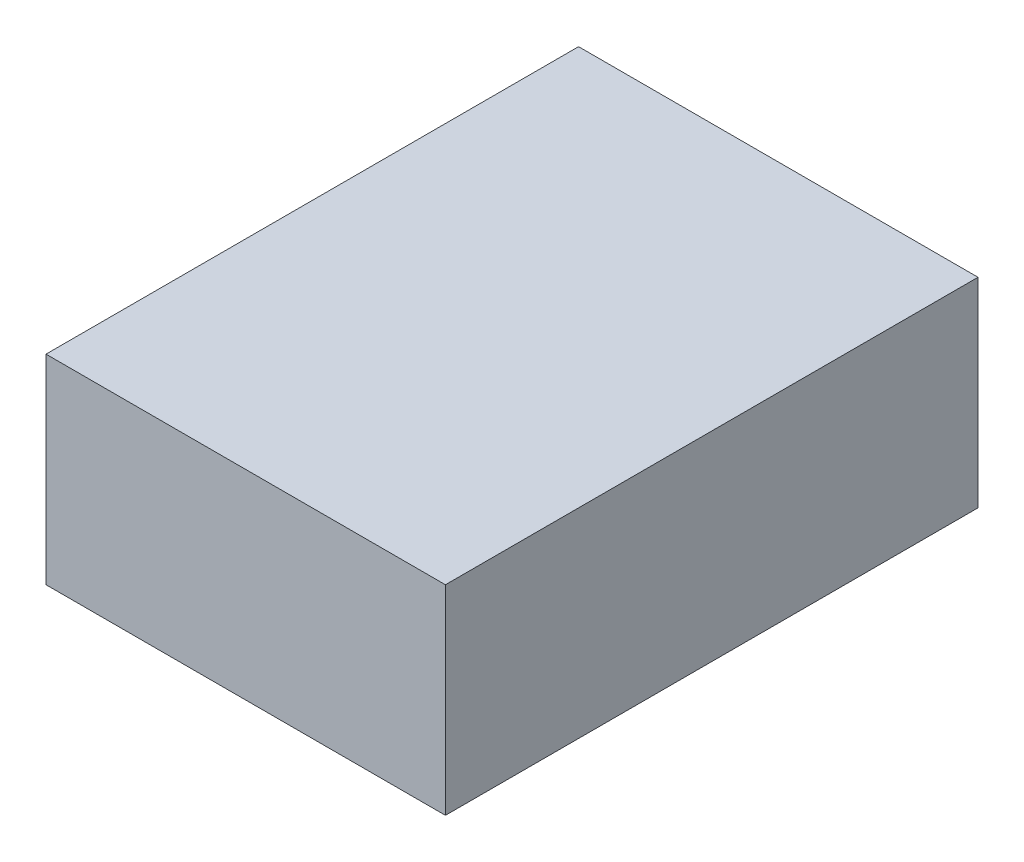
ISO-10303-21;
HEADER;
FILE_DESCRIPTION(('STEP AP214'),'2;1');
FILE_NAME('part.step','',(''),(''),'','','');
FILE_SCHEMA(('AUTOMOTIVE_DESIGN { 1 0 10303 214 1 1 1 1 }'));
ENDSEC;
DATA;
#1=APPLICATION_CONTEXT('core data for automotive mechanical design processes');
#2=APPLICATION_PROTOCOL_DEFINITION('international standard','automotive_design',2000,#1);
#3=PRODUCT_CONTEXT('',#1,'mechanical');
#4=PRODUCT('Part','Part','',(#3));
#5=PRODUCT_RELATED_PRODUCT_CATEGORY('part','',(#4));
#6=PRODUCT_DEFINITION_FORMATION('','',#4);
#7=PRODUCT_DEFINITION_CONTEXT('part definition',#1,'design');
#8=PRODUCT_DEFINITION('design','',#6,#7);
#9=PRODUCT_DEFINITION_SHAPE('','',#8);
#10=(LENGTH_UNIT() NAMED_UNIT(*) SI_UNIT(.MILLI.,.METRE.));
#11=(NAMED_UNIT(*) PLANE_ANGLE_UNIT() SI_UNIT($,.RADIAN.));
#12=(NAMED_UNIT(*) SI_UNIT($,.STERADIAN.) SOLID_ANGLE_UNIT());
#13=UNCERTAINTY_MEASURE_WITH_UNIT(LENGTH_MEASURE(1.E-05),#10,'distance_accuracy_value','');
#14=(GEOMETRIC_REPRESENTATION_CONTEXT(3) GLOBAL_UNCERTAINTY_ASSIGNED_CONTEXT((#13)) GLOBAL_UNIT_ASSIGNED_CONTEXT((#10,
#11,#12)) REPRESENTATION_CONTEXT('',''));
#15=CARTESIAN_POINT('',(0.,0.,0.));
#16=DIRECTION('',(0.,0.,1.));
#17=DIRECTION('',(1.,0.,0.));
#18=AXIS2_PLACEMENT_3D('',#15,#16,#17);
#19=CARTESIAN_POINT('',(0.,0.,40.));
#20=DIRECTION('',(-1.,0.,0.));
#21=DIRECTION('',(0.,-1.,0.));
#22=AXIS2_PLACEMENT_3D('',#19,#20,#21);
#23=PLANE('',#22);
#24=DIRECTION('',(0.,1.,0.));
#25=VECTOR('',#24,1.);
#26=CARTESIAN_POINT('',(0.,0.,0.));
#27=LINE('',#26,#25);
#28=CARTESIAN_POINT('',(0.,0.,0.));
#29=VERTEX_POINT('',#28);
#30=CARTESIAN_POINT('',(0.,15.,0.));
#31=VERTEX_POINT('',#30);
#32=EDGE_CURVE('E100',#29,#31,#27,.T.);
#33=ORIENTED_EDGE('',*,*,#32,.T.);
#34=DIRECTION('',(0.,0.,-1.));
#35=VECTOR('',#34,1.);
#36=CARTESIAN_POINT('',(0.,15.,40.));
#37=LINE('',#36,#35);
#38=CARTESIAN_POINT('',(0.,15.,40.));
#39=VERTEX_POINT('',#38);
#40=EDGE_CURVE('E11',#39,#31,#37,.T.);
#41=ORIENTED_EDGE('',*,*,#40,.F.);
#42=DIRECTION('',(0.,1.,0.));
#43=VECTOR('',#42,1.);
#44=CARTESIAN_POINT('',(0.,0.,40.));
#45=LINE('',#44,#43);
#46=CARTESIAN_POINT('',(0.,0.,40.));
#47=VERTEX_POINT('',#46);
#48=EDGE_CURVE('E88',#47,#39,#45,.T.);
#49=ORIENTED_EDGE('',*,*,#48,.F.);
#50=DIRECTION('',(0.,0.,-1.));
#51=VECTOR('',#50,1.);
#52=CARTESIAN_POINT('',(0.,0.,40.));
#53=LINE('',#52,#51);
#54=EDGE_CURVE('E96',#47,#29,#53,.T.);
#55=ORIENTED_EDGE('',*,*,#54,.T.);
#56=EDGE_LOOP('',(#33,#41,#49,#55));
#57=FACE_BOUND('',#56,.T.);
#58=ADVANCED_FACE('F37',(#57),#23,.F.);
#59=CARTESIAN_POINT('',(0.,15.,40.));
#60=DIRECTION('',(0.,-1.,0.));
#61=DIRECTION('',(1.,0.,0.));
#62=AXIS2_PLACEMENT_3D('',#59,#60,#61);
#63=PLANE('',#62);
#64=DIRECTION('',(-1.,0.,0.));
#65=VECTOR('',#64,1.);
#66=CARTESIAN_POINT('',(0.,15.,0.));
#67=LINE('',#66,#65);
#68=CARTESIAN_POINT('',(-30.,15.,0.));
#69=VERTEX_POINT('',#68);
#70=EDGE_CURVE('E92',#31,#69,#67,.T.);
#71=ORIENTED_EDGE('',*,*,#70,.T.);
#72=DIRECTION('',(0.,0.,-1.));
#73=VECTOR('',#72,1.);
#74=CARTESIAN_POINT('',(-30.,15.,40.));
#75=LINE('',#74,#73);
#76=CARTESIAN_POINT('',(-30.,15.,40.));
#77=VERTEX_POINT('',#76);
#78=EDGE_CURVE('E45',#77,#69,#75,.T.);
#79=ORIENTED_EDGE('',*,*,#78,.F.);
#80=DIRECTION('',(-1.,0.,0.));
#81=VECTOR('',#80,1.);
#82=CARTESIAN_POINT('',(0.,15.,40.));
#83=LINE('',#82,#81);
#84=EDGE_CURVE('E83',#39,#77,#83,.T.);
#85=ORIENTED_EDGE('',*,*,#84,.F.);
#86=ORIENTED_EDGE('',*,*,#40,.T.);
#87=EDGE_LOOP('',(#71,#79,#85,#86));
#88=FACE_BOUND('',#87,.T.);
#89=ADVANCED_FACE('F91',(#88),#63,.F.);
#90=CARTESIAN_POINT('',(-30.,0.,40.));
#91=DIRECTION('',(1.,0.,0.));
#92=DIRECTION('',(0.,0.,-1.));
#93=AXIS2_PLACEMENT_3D('',#90,#91,#92);
#94=PLANE('',#93);
#95=DIRECTION('',(0.,-1.,0.));
#96=VECTOR('',#95,1.);
#97=CARTESIAN_POINT('',(-30.,0.,0.));
#98=LINE('',#97,#96);
#99=CARTESIAN_POINT('',(-30.,0.,0.));
#100=VERTEX_POINT('',#99);
#101=EDGE_CURVE('E70',#69,#100,#98,.T.);
#102=ORIENTED_EDGE('',*,*,#101,.T.);
#103=DIRECTION('',(0.,0.,-1.));
#104=VECTOR('',#103,1.);
#105=CARTESIAN_POINT('',(-30.,0.,40.));
#106=LINE('',#105,#104);
#107=CARTESIAN_POINT('',(-30.,0.,40.));
#108=VERTEX_POINT('',#107);
#109=EDGE_CURVE('E93',#108,#100,#106,.T.);
#110=ORIENTED_EDGE('',*,*,#109,.F.);
#111=DIRECTION('',(0.,-1.,0.));
#112=VECTOR('',#111,1.);
#113=CARTESIAN_POINT('',(-30.,0.,40.));
#114=LINE('',#113,#112);
#115=EDGE_CURVE('E86',#77,#108,#114,.T.);
#116=ORIENTED_EDGE('',*,*,#115,.F.);
#117=ORIENTED_EDGE('',*,*,#78,.T.);
#118=EDGE_LOOP('',(#102,#110,#116,#117));
#119=FACE_BOUND('',#118,.T.);
#120=ADVANCED_FACE('F94',(#119),#94,.F.);
#121=CARTESIAN_POINT('',(0.,0.,40.));
#122=DIRECTION('',(0.,1.,0.));
#123=DIRECTION('',(-1.,0.,0.));
#124=AXIS2_PLACEMENT_3D('',#121,#122,#123);
#125=PLANE('',#124);
#126=DIRECTION('',(1.,0.,0.));
#127=VECTOR('',#126,1.);
#128=CARTESIAN_POINT('',(0.,0.,0.));
#129=LINE('',#128,#127);
#130=EDGE_CURVE('E76',#100,#29,#129,.T.);
#131=ORIENTED_EDGE('',*,*,#130,.T.);
#132=ORIENTED_EDGE('',*,*,#54,.F.);
#133=DIRECTION('',(1.,0.,0.));
#134=VECTOR('',#133,1.);
#135=CARTESIAN_POINT('',(0.,0.,40.));
#136=LINE('',#135,#134);
#137=EDGE_CURVE('E53',#108,#47,#136,.T.);
#138=ORIENTED_EDGE('',*,*,#137,.F.);
#139=ORIENTED_EDGE('',*,*,#109,.T.);
#140=EDGE_LOOP('',(#131,#132,#138,#139));
#141=FACE_BOUND('',#140,.T.);
#142=ADVANCED_FACE('F107',(#141),#125,.F.);
#143=CARTESIAN_POINT('',(0.,0.,40.));
#144=DIRECTION('',(0.,0.,1.));
#145=DIRECTION('',(1.,0.,0.));
#146=AXIS2_PLACEMENT_3D('',#143,#144,#145);
#147=PLANE('',#146);
#148=ORIENTED_EDGE('',*,*,#48,.T.);
#149=ORIENTED_EDGE('',*,*,#84,.T.);
#150=ORIENTED_EDGE('',*,*,#115,.T.);
#151=ORIENTED_EDGE('',*,*,#137,.T.);
#152=EDGE_LOOP('',(#148,#149,#150,#151));
#153=FACE_BOUND('',#152,.T.);
#154=ADVANCED_FACE('F84',(#153),#147,.T.);
#155=CARTESIAN_POINT('',(0.,0.,0.));
#156=DIRECTION('',(0.,0.,1.));
#157=DIRECTION('',(1.,0.,0.));
#158=AXIS2_PLACEMENT_3D('',#155,#156,#157);
#159=PLANE('',#158);
#160=ORIENTED_EDGE('',*,*,#32,.F.);
#161=ORIENTED_EDGE('',*,*,#130,.F.);
#162=ORIENTED_EDGE('',*,*,#101,.F.);
#163=ORIENTED_EDGE('',*,*,#70,.F.);
#164=EDGE_LOOP('',(#160,#161,#162,#163));
#165=FACE_BOUND('',#164,.T.);
#166=ADVANCED_FACE('F110',(#165),#159,.F.);
#167=CLOSED_SHELL('',(#58,#89,#120,#142,#154,#166));
#168=MANIFOLD_SOLID_BREP('B2',#167);
#169=ADVANCED_BREP_SHAPE_REPRESENTATION('',(#18,#168),#14);
#170=SHAPE_DEFINITION_REPRESENTATION(#9,#169);
ENDSEC;
END-ISO-10303-21;
